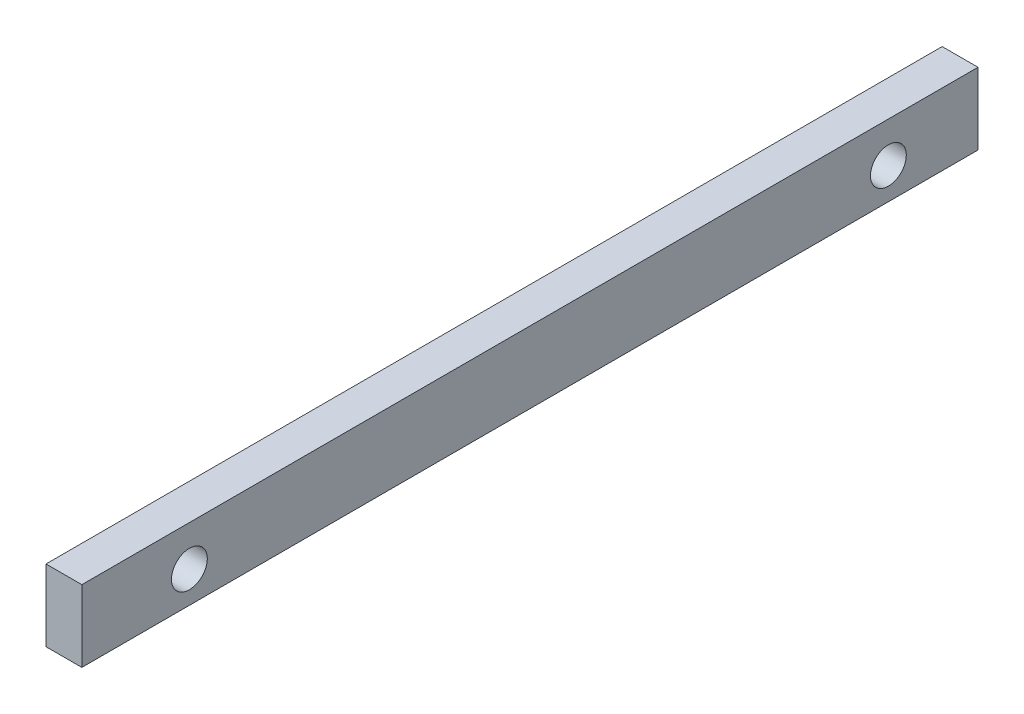
ISO-10303-21;
HEADER;
FILE_DESCRIPTION(('STEP AP214'),'2;1');
FILE_NAME('part.step','',(''),(''),'','','');
FILE_SCHEMA(('AUTOMOTIVE_DESIGN { 1 0 10303 214 1 1 1 1 }'));
ENDSEC;
DATA;
#1=APPLICATION_CONTEXT('core data for automotive mechanical design processes');
#2=APPLICATION_PROTOCOL_DEFINITION('international standard','automotive_design',2000,#1);
#3=PRODUCT_CONTEXT('',#1,'mechanical');
#4=PRODUCT('Part','Part','',(#3));
#5=PRODUCT_RELATED_PRODUCT_CATEGORY('part','',(#4));
#6=PRODUCT_DEFINITION_FORMATION('','',#4);
#7=PRODUCT_DEFINITION_CONTEXT('part definition',#1,'design');
#8=PRODUCT_DEFINITION('design','',#6,#7);
#9=PRODUCT_DEFINITION_SHAPE('','',#8);
#10=(LENGTH_UNIT() NAMED_UNIT(*) SI_UNIT(.MILLI.,.METRE.));
#11=(NAMED_UNIT(*) PLANE_ANGLE_UNIT() SI_UNIT($,.RADIAN.));
#12=(NAMED_UNIT(*) SI_UNIT($,.STERADIAN.) SOLID_ANGLE_UNIT());
#13=UNCERTAINTY_MEASURE_WITH_UNIT(LENGTH_MEASURE(1.E-05),#10,'distance_accuracy_value','');
#14=(GEOMETRIC_REPRESENTATION_CONTEXT(3) GLOBAL_UNCERTAINTY_ASSIGNED_CONTEXT((#13)) GLOBAL_UNIT_ASSIGNED_CONTEXT((#10,
#11,#12)) REPRESENTATION_CONTEXT('',''));
#15=CARTESIAN_POINT('',(0.,0.,0.));
#16=DIRECTION('',(0.,0.,1.));
#17=DIRECTION('',(1.,0.,0.));
#18=AXIS2_PLACEMENT_3D('',#15,#16,#17);
#19=CARTESIAN_POINT('',(4.,0.,0.));
#20=DIRECTION('',(1.,0.,0.));
#21=DIRECTION('',(0.,0.,-1.));
#22=AXIS2_PLACEMENT_3D('',#19,#20,#21);
#23=PLANE('',#22);
#24=CARTESIAN_POINT('',(4.,0.82746625537309,28.137341684183));
#25=DIRECTION('',(1.,0.,0.));
#26=DIRECTION('',(0.,0.,-1.));
#27=AXIS2_PLACEMENT_3D('',#24,#25,#26);
#28=CIRCLE('',#27,2.);
#29=CARTESIAN_POINT('',(4.,0.82746625537309,26.137341684183));
#30=VERTEX_POINT('',#29);
#31=EDGE_CURVE('E100',#30,#30,#28,.T.);
#32=ORIENTED_EDGE('',*,*,#31,.F.);
#33=EDGE_LOOP('',(#32));
#34=FACE_BOUND('',#33,.T.);
#35=DIRECTION('',(0.,-1.,0.));
#36=VECTOR('',#35,1.);
#37=CARTESIAN_POINT('',(4.,5.31595867682489,40.137341684183));
#38=LINE('',#37,#36);
#39=CARTESIAN_POINT('',(4.,5.31595867682489,40.137341684183));
#40=VERTEX_POINT('',#39);
#41=CARTESIAN_POINT('',(4.,-2.68404132317511,40.137341684183));
#42=VERTEX_POINT('',#41);
#43=EDGE_CURVE('E85',#40,#42,#38,.T.);
#44=ORIENTED_EDGE('',*,*,#43,.T.);
#45=DIRECTION('',(0.,0.,-1.));
#46=VECTOR('',#45,1.);
#47=CARTESIAN_POINT('',(4.,-2.68404132317511,40.137341684183));
#48=LINE('',#47,#46);
#49=CARTESIAN_POINT('',(4.,-2.68404132317511,-59.862658315817));
#50=VERTEX_POINT('',#49);
#51=EDGE_CURVE('E80',#42,#50,#48,.T.);
#52=ORIENTED_EDGE('',*,*,#51,.T.);
#53=DIRECTION('',(0.,1.,0.));
#54=VECTOR('',#53,1.);
#55=CARTESIAN_POINT('',(4.,5.31595867682489,-59.862658315817));
#56=LINE('',#55,#54);
#57=CARTESIAN_POINT('',(4.,5.31595867682489,-59.862658315817));
#58=VERTEX_POINT('',#57);
#59=EDGE_CURVE('E83',#50,#58,#56,.T.);
#60=ORIENTED_EDGE('',*,*,#59,.T.);
#61=DIRECTION('',(0.,0.,1.));
#62=VECTOR('',#61,1.);
#63=CARTESIAN_POINT('',(4.,5.31595867682489,40.137341684183));
#64=LINE('',#63,#62);
#65=EDGE_CURVE('E50',#58,#40,#64,.T.);
#66=ORIENTED_EDGE('',*,*,#65,.T.);
#67=EDGE_LOOP('',(#44,#52,#60,#66));
#68=FACE_BOUND('',#67,.T.);
#69=CARTESIAN_POINT('',(4.,0.82746625537309,-49.862658315817));
#70=DIRECTION('',(1.,0.,0.));
#71=DIRECTION('',(0.,0.,-1.));
#72=AXIS2_PLACEMENT_3D('',#69,#70,#71);
#73=CIRCLE('',#72,2.);
#74=CARTESIAN_POINT('',(4.,0.82746625537309,-51.862658315817));
#75=VERTEX_POINT('',#74);
#76=EDGE_CURVE('E115',#75,#75,#73,.T.);
#77=ORIENTED_EDGE('',*,*,#76,.F.);
#78=EDGE_LOOP('',(#77));
#79=FACE_BOUND('',#78,.T.);
#80=ADVANCED_FACE('F33',(#34,#68,#79),#23,.T.);
#81=CARTESIAN_POINT('',(0.,0.,0.));
#82=DIRECTION('',(1.,0.,0.));
#83=DIRECTION('',(0.,0.,-1.));
#84=AXIS2_PLACEMENT_3D('',#81,#82,#83);
#85=PLANE('',#84);
#86=DIRECTION('',(0.,-1.,0.));
#87=VECTOR('',#86,1.);
#88=CARTESIAN_POINT('',(0.,5.31595867682489,40.137341684183));
#89=LINE('',#88,#87);
#90=CARTESIAN_POINT('',(0.,5.31595867682489,40.137341684183));
#91=VERTEX_POINT('',#90);
#92=CARTESIAN_POINT('',(0.,-2.68404132317511,40.137341684183));
#93=VERTEX_POINT('',#92);
#94=EDGE_CURVE('E97',#91,#93,#89,.T.);
#95=ORIENTED_EDGE('',*,*,#94,.F.);
#96=DIRECTION('',(0.,0.,1.));
#97=VECTOR('',#96,1.);
#98=CARTESIAN_POINT('',(0.,5.31595867682489,40.137341684183));
#99=LINE('',#98,#97);
#100=CARTESIAN_POINT('',(0.,5.31595867682489,-59.862658315817));
#101=VERTEX_POINT('',#100);
#102=EDGE_CURVE('E73',#101,#91,#99,.T.);
#103=ORIENTED_EDGE('',*,*,#102,.F.);
#104=DIRECTION('',(0.,1.,0.));
#105=VECTOR('',#104,1.);
#106=CARTESIAN_POINT('',(0.,5.31595867682489,-59.862658315817));
#107=LINE('',#106,#105);
#108=CARTESIAN_POINT('',(0.,-2.68404132317511,-59.862658315817));
#109=VERTEX_POINT('',#108);
#110=EDGE_CURVE('E67',#109,#101,#107,.T.);
#111=ORIENTED_EDGE('',*,*,#110,.F.);
#112=DIRECTION('',(0.,0.,-1.));
#113=VECTOR('',#112,1.);
#114=CARTESIAN_POINT('',(0.,-2.68404132317511,40.137341684183));
#115=LINE('',#114,#113);
#116=EDGE_CURVE('E89',#93,#109,#115,.T.);
#117=ORIENTED_EDGE('',*,*,#116,.F.);
#118=EDGE_LOOP('',(#95,#103,#111,#117));
#119=FACE_BOUND('',#118,.T.);
#120=CARTESIAN_POINT('',(0.,0.82746625537309,28.137341684183));
#121=DIRECTION('',(1.,0.,0.));
#122=DIRECTION('',(0.,0.,-1.));
#123=AXIS2_PLACEMENT_3D('',#120,#121,#122);
#124=CIRCLE('',#123,2.);
#125=CARTESIAN_POINT('',(0.,0.82746625537309,26.137341684183));
#126=VERTEX_POINT('',#125);
#127=EDGE_CURVE('E112',#126,#126,#124,.T.);
#128=ORIENTED_EDGE('',*,*,#127,.T.);
#129=EDGE_LOOP('',(#128));
#130=FACE_BOUND('',#129,.T.);
#131=CARTESIAN_POINT('',(0.,0.82746625537309,-49.862658315817));
#132=DIRECTION('',(1.,0.,0.));
#133=DIRECTION('',(0.,0.,-1.));
#134=AXIS2_PLACEMENT_3D('',#131,#132,#133);
#135=CIRCLE('',#134,2.);
#136=CARTESIAN_POINT('',(0.,0.82746625537309,-51.862658315817));
#137=VERTEX_POINT('',#136);
#138=EDGE_CURVE('E118',#137,#137,#135,.T.);
#139=ORIENTED_EDGE('',*,*,#138,.T.);
#140=EDGE_LOOP('',(#139));
#141=FACE_BOUND('',#140,.T.);
#142=ADVANCED_FACE('F108',(#119,#130,#141),#85,.F.);
#143=CARTESIAN_POINT('',(4.,5.31595867682489,40.137341684183));
#144=DIRECTION('',(0.,0.,-1.));
#145=DIRECTION('',(-1.,0.,0.));
#146=AXIS2_PLACEMENT_3D('',#143,#144,#145);
#147=PLANE('',#146);
#148=ORIENTED_EDGE('',*,*,#94,.T.);
#149=DIRECTION('',(-1.,0.,0.));
#150=VECTOR('',#149,1.);
#151=CARTESIAN_POINT('',(4.,-2.68404132317511,40.137341684183));
#152=LINE('',#151,#150);
#153=EDGE_CURVE('E11',#42,#93,#152,.T.);
#154=ORIENTED_EDGE('',*,*,#153,.F.);
#155=ORIENTED_EDGE('',*,*,#43,.F.);
#156=DIRECTION('',(-1.,0.,0.));
#157=VECTOR('',#156,1.);
#158=CARTESIAN_POINT('',(4.,5.31595867682489,40.137341684183));
#159=LINE('',#158,#157);
#160=EDGE_CURVE('E93',#40,#91,#159,.T.);
#161=ORIENTED_EDGE('',*,*,#160,.T.);
#162=EDGE_LOOP('',(#148,#154,#155,#161));
#163=FACE_BOUND('',#162,.T.);
#164=ADVANCED_FACE('F35',(#163),#147,.F.);
#165=CARTESIAN_POINT('',(4.,-2.68404132317511,40.137341684183));
#166=DIRECTION('',(0.,1.,0.));
#167=DIRECTION('',(0.,0.,1.));
#168=AXIS2_PLACEMENT_3D('',#165,#166,#167);
#169=PLANE('',#168);
#170=ORIENTED_EDGE('',*,*,#116,.T.);
#171=DIRECTION('',(-1.,0.,0.));
#172=VECTOR('',#171,1.);
#173=CARTESIAN_POINT('',(4.,-2.68404132317511,-59.862658315817));
#174=LINE('',#173,#172);
#175=EDGE_CURVE('E42',#50,#109,#174,.T.);
#176=ORIENTED_EDGE('',*,*,#175,.F.);
#177=ORIENTED_EDGE('',*,*,#51,.F.);
#178=ORIENTED_EDGE('',*,*,#153,.T.);
#179=EDGE_LOOP('',(#170,#176,#177,#178));
#180=FACE_BOUND('',#179,.T.);
#181=ADVANCED_FACE('F88',(#180),#169,.F.);
#182=CARTESIAN_POINT('',(4.,5.31595867682489,-59.862658315817));
#183=DIRECTION('',(0.,0.,1.));
#184=DIRECTION('',(1.,0.,0.));
#185=AXIS2_PLACEMENT_3D('',#182,#183,#184);
#186=PLANE('',#185);
#187=ORIENTED_EDGE('',*,*,#110,.T.);
#188=DIRECTION('',(-1.,0.,0.));
#189=VECTOR('',#188,1.);
#190=CARTESIAN_POINT('',(4.,5.31595867682489,-59.862658315817));
#191=LINE('',#190,#189);
#192=EDGE_CURVE('E90',#58,#101,#191,.T.);
#193=ORIENTED_EDGE('',*,*,#192,.F.);
#194=ORIENTED_EDGE('',*,*,#59,.F.);
#195=ORIENTED_EDGE('',*,*,#175,.T.);
#196=EDGE_LOOP('',(#187,#193,#194,#195));
#197=FACE_BOUND('',#196,.T.);
#198=ADVANCED_FACE('F91',(#197),#186,.F.);
#199=CARTESIAN_POINT('',(4.,5.31595867682489,40.137341684183));
#200=DIRECTION('',(0.,-1.,0.));
#201=DIRECTION('',(0.,0.,-1.));
#202=AXIS2_PLACEMENT_3D('',#199,#200,#201);
#203=PLANE('',#202);
#204=ORIENTED_EDGE('',*,*,#102,.T.);
#205=ORIENTED_EDGE('',*,*,#160,.F.);
#206=ORIENTED_EDGE('',*,*,#65,.F.);
#207=ORIENTED_EDGE('',*,*,#192,.T.);
#208=EDGE_LOOP('',(#204,#205,#206,#207));
#209=FACE_BOUND('',#208,.T.);
#210=ADVANCED_FACE('F105',(#209),#203,.F.);
#211=CARTESIAN_POINT('',(4.,0.82746625537309,28.137341684183));
#212=DIRECTION('',(-1.,0.,0.));
#213=DIRECTION('',(0.,0.,1.));
#214=AXIS2_PLACEMENT_3D('',#211,#212,#213);
#215=CYLINDRICAL_SURFACE('',#214,2.);
#216=ORIENTED_EDGE('',*,*,#31,.T.);
#217=EDGE_LOOP('',(#216));
#218=FACE_BOUND('',#217,.T.);
#219=ORIENTED_EDGE('',*,*,#127,.F.);
#220=EDGE_LOOP('',(#219));
#221=FACE_BOUND('',#220,.T.);
#222=ADVANCED_FACE('F135',(#218,#221),#215,.F.);
#223=CARTESIAN_POINT('',(4.,0.82746625537309,-49.862658315817));
#224=DIRECTION('',(-1.,0.,0.));
#225=DIRECTION('',(0.,0.,1.));
#226=AXIS2_PLACEMENT_3D('',#223,#224,#225);
#227=CYLINDRICAL_SURFACE('',#226,2.);
#228=ORIENTED_EDGE('',*,*,#76,.T.);
#229=EDGE_LOOP('',(#228));
#230=FACE_BOUND('',#229,.T.);
#231=ORIENTED_EDGE('',*,*,#138,.F.);
#232=EDGE_LOOP('',(#231));
#233=FACE_BOUND('',#232,.T.);
#234=ADVANCED_FACE('F124',(#230,#233),#227,.F.);
#235=CLOSED_SHELL('',(#80,#142,#164,#181,#198,#210,#222,#234));
#236=MANIFOLD_SOLID_BREP('B2',#235);
#237=ADVANCED_BREP_SHAPE_REPRESENTATION('',(#18,#236),#14);
#238=SHAPE_DEFINITION_REPRESENTATION(#9,#237);
ENDSEC;
END-ISO-10303-21;
